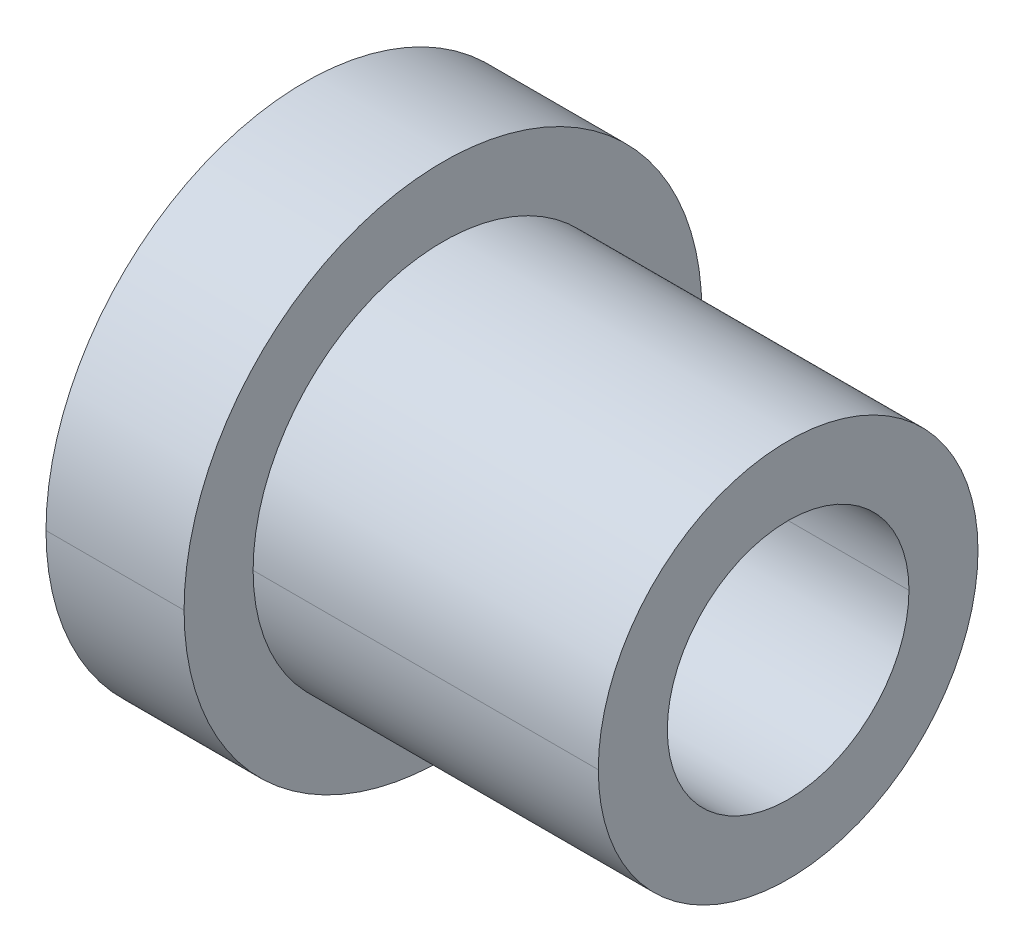
ISO-10303-21;
HEADER;
FILE_DESCRIPTION(('STEP AP214'),'2;1');
FILE_NAME('part.step','',(''),(''),'','','');
FILE_SCHEMA(('AUTOMOTIVE_DESIGN { 1 0 10303 214 1 1 1 1 }'));
ENDSEC;
DATA;
#1=APPLICATION_CONTEXT('core data for automotive mechanical design processes');
#2=APPLICATION_PROTOCOL_DEFINITION('international standard','automotive_design',2000,#1);
#3=PRODUCT_CONTEXT('',#1,'mechanical');
#4=PRODUCT('Part','Part','',(#3));
#5=PRODUCT_RELATED_PRODUCT_CATEGORY('part','',(#4));
#6=PRODUCT_DEFINITION_FORMATION('','',#4);
#7=PRODUCT_DEFINITION_CONTEXT('part definition',#1,'design');
#8=PRODUCT_DEFINITION('design','',#6,#7);
#9=PRODUCT_DEFINITION_SHAPE('','',#8);
#10=(LENGTH_UNIT() NAMED_UNIT(*) SI_UNIT(.MILLI.,.METRE.));
#11=(NAMED_UNIT(*) PLANE_ANGLE_UNIT() SI_UNIT($,.RADIAN.));
#12=(NAMED_UNIT(*) SI_UNIT($,.STERADIAN.) SOLID_ANGLE_UNIT());
#13=UNCERTAINTY_MEASURE_WITH_UNIT(LENGTH_MEASURE(1.E-05),#10,'distance_accuracy_value','');
#14=(GEOMETRIC_REPRESENTATION_CONTEXT(3) GLOBAL_UNCERTAINTY_ASSIGNED_CONTEXT((#13)) GLOBAL_UNIT_ASSIGNED_CONTEXT((#10,
#11,#12)) REPRESENTATION_CONTEXT('',''));
#15=CARTESIAN_POINT('',(0.,0.,0.));
#16=DIRECTION('',(0.,0.,1.));
#17=DIRECTION('',(1.,0.,0.));
#18=AXIS2_PLACEMENT_3D('',#15,#16,#17);
#19=CARTESIAN_POINT('',(7.,0.,0.));
#20=DIRECTION('',(-1.,0.,0.));
#21=DIRECTION('',(0.,0.,-1.));
#22=AXIS2_PLACEMENT_3D('',#19,#20,#21);
#23=CYLINDRICAL_SURFACE('',#22,1.75);
#24=DIRECTION('',(-1.,0.,0.));
#25=VECTOR('',#24,1.);
#26=CARTESIAN_POINT('',(7.,0.,-1.75));
#27=LINE('',#26,#25);
#28=CARTESIAN_POINT('',(7.,0.,-1.75));
#29=VERTEX_POINT('',#28);
#30=CARTESIAN_POINT('',(0.,0.,-1.75));
#31=VERTEX_POINT('',#30);
#32=EDGE_CURVE('E141',#29,#31,#27,.T.);
#33=ORIENTED_EDGE('',*,*,#32,.F.);
#34=CARTESIAN_POINT('',(7.,0.,0.));
#35=DIRECTION('',(-1.,0.,0.));
#36=DIRECTION('',(0.,0.,1.));
#37=AXIS2_PLACEMENT_3D('',#34,#35,#36);
#38=CIRCLE('',#37,1.75);
#39=CARTESIAN_POINT('',(7.,0.,1.75));
#40=VERTEX_POINT('',#39);
#41=EDGE_CURVE('E11',#40,#29,#38,.T.);
#42=ORIENTED_EDGE('',*,*,#41,.F.);
#43=DIRECTION('',(-1.,0.,0.));
#44=VECTOR('',#43,1.);
#45=CARTESIAN_POINT('',(7.,0.,1.75));
#46=LINE('',#45,#44);
#47=CARTESIAN_POINT('',(0.,0.,1.75));
#48=VERTEX_POINT('',#47);
#49=EDGE_CURVE('E146',#40,#48,#46,.T.);
#50=ORIENTED_EDGE('',*,*,#49,.T.);
#51=CARTESIAN_POINT('',(0.,0.,0.));
#52=DIRECTION('',(1.,0.,0.));
#53=DIRECTION('',(0.,0.,-1.));
#54=AXIS2_PLACEMENT_3D('',#51,#52,#53);
#55=CIRCLE('',#54,1.75);
#56=EDGE_CURVE('E117',#31,#48,#55,.T.);
#57=ORIENTED_EDGE('',*,*,#56,.F.);
#58=EDGE_LOOP('',(#33,#42,#50,#57));
#59=FACE_BOUND('',#58,.T.);
#60=ADVANCED_FACE('F17',(#59),#23,.F.);
#61=CARTESIAN_POINT('',(7.,0.,0.));
#62=DIRECTION('',(-1.,0.,0.));
#63=DIRECTION('',(0.,0.,-1.));
#64=AXIS2_PLACEMENT_3D('',#61,#62,#63);
#65=CYLINDRICAL_SURFACE('',#64,2.75);
#66=DIRECTION('',(-1.,0.,0.));
#67=VECTOR('',#66,1.);
#68=CARTESIAN_POINT('',(7.,0.,-2.75));
#69=LINE('',#68,#67);
#70=CARTESIAN_POINT('',(7.,0.,-2.75));
#71=VERTEX_POINT('',#70);
#72=CARTESIAN_POINT('',(2.,0.,-2.75));
#73=VERTEX_POINT('',#72);
#74=EDGE_CURVE('E90',#71,#73,#69,.T.);
#75=ORIENTED_EDGE('',*,*,#74,.T.);
#76=CARTESIAN_POINT('',(2.,0.,0.));
#77=DIRECTION('',(-1.,0.,0.));
#78=DIRECTION('',(0.,0.,1.));
#79=AXIS2_PLACEMENT_3D('',#76,#77,#78);
#80=CIRCLE('',#79,2.75);
#81=CARTESIAN_POINT('',(2.,0.,2.75));
#82=VERTEX_POINT('',#81);
#83=EDGE_CURVE('E106',#82,#73,#80,.T.);
#84=ORIENTED_EDGE('',*,*,#83,.F.);
#85=DIRECTION('',(-1.,0.,0.));
#86=VECTOR('',#85,1.);
#87=CARTESIAN_POINT('',(7.,0.,2.75));
#88=LINE('',#87,#86);
#89=CARTESIAN_POINT('',(7.,0.,2.75));
#90=VERTEX_POINT('',#89);
#91=EDGE_CURVE('E96',#90,#82,#88,.T.);
#92=ORIENTED_EDGE('',*,*,#91,.F.);
#93=CARTESIAN_POINT('',(7.,0.,0.));
#94=DIRECTION('',(1.,0.,0.));
#95=DIRECTION('',(0.,0.,-1.));
#96=AXIS2_PLACEMENT_3D('',#93,#94,#95);
#97=CIRCLE('',#96,2.75);
#98=EDGE_CURVE('E21',#71,#90,#97,.T.);
#99=ORIENTED_EDGE('',*,*,#98,.F.);
#100=EDGE_LOOP('',(#75,#84,#92,#99));
#101=FACE_BOUND('',#100,.T.);
#102=ADVANCED_FACE('F19',(#101),#65,.T.);
#103=CARTESIAN_POINT('',(7.,1.75,0.));
#104=DIRECTION('',(1.,0.,0.));
#105=DIRECTION('',(0.,1.,0.));
#106=AXIS2_PLACEMENT_3D('',#103,#104,#105);
#107=PLANE('',#106);
#108=ORIENTED_EDGE('',*,*,#41,.T.);
#109=CARTESIAN_POINT('',(7.,0.,0.));
#110=DIRECTION('',(-1.,0.,0.));
#111=DIRECTION('',(0.,0.,-1.));
#112=AXIS2_PLACEMENT_3D('',#109,#110,#111);
#113=CIRCLE('',#112,1.75);
#114=EDGE_CURVE('E145',#29,#40,#113,.T.);
#115=ORIENTED_EDGE('',*,*,#114,.T.);
#116=EDGE_LOOP('',(#108,#115));
#117=FACE_BOUND('',#116,.T.);
#118=CARTESIAN_POINT('',(7.,0.,0.));
#119=DIRECTION('',(1.,0.,0.));
#120=DIRECTION('',(0.,0.,1.));
#121=AXIS2_PLACEMENT_3D('',#118,#119,#120);
#122=CIRCLE('',#121,2.75);
#123=EDGE_CURVE('E101',#90,#71,#122,.T.);
#124=ORIENTED_EDGE('',*,*,#123,.T.);
#125=ORIENTED_EDGE('',*,*,#98,.T.);
#126=EDGE_LOOP('',(#124,#125));
#127=FACE_BOUND('',#126,.T.);
#128=ADVANCED_FACE('F173',(#117,#127),#107,.T.);
#129=CARTESIAN_POINT('',(7.,0.,0.));
#130=DIRECTION('',(-1.,0.,0.));
#131=DIRECTION('',(0.,0.,-1.));
#132=AXIS2_PLACEMENT_3D('',#129,#130,#131);
#133=CYLINDRICAL_SURFACE('',#132,2.75);
#134=ORIENTED_EDGE('',*,*,#91,.T.);
#135=CARTESIAN_POINT('',(2.,0.,0.));
#136=DIRECTION('',(-1.,0.,0.));
#137=DIRECTION('',(0.,0.,-1.));
#138=AXIS2_PLACEMENT_3D('',#135,#136,#137);
#139=CIRCLE('',#138,2.75);
#140=EDGE_CURVE('E99',#73,#82,#139,.T.);
#141=ORIENTED_EDGE('',*,*,#140,.F.);
#142=ORIENTED_EDGE('',*,*,#74,.F.);
#143=ORIENTED_EDGE('',*,*,#123,.F.);
#144=EDGE_LOOP('',(#134,#141,#142,#143));
#145=FACE_BOUND('',#144,.T.);
#146=ADVANCED_FACE('F98',(#145),#133,.T.);
#147=CARTESIAN_POINT('',(7.,0.,0.));
#148=DIRECTION('',(-1.,0.,0.));
#149=DIRECTION('',(0.,0.,-1.));
#150=AXIS2_PLACEMENT_3D('',#147,#148,#149);
#151=CYLINDRICAL_SURFACE('',#150,3.75);
#152=DIRECTION('',(-1.,0.,0.));
#153=VECTOR('',#152,1.);
#154=CARTESIAN_POINT('',(2.,0.,-3.75));
#155=LINE('',#154,#153);
#156=CARTESIAN_POINT('',(2.,0.,-3.75));
#157=VERTEX_POINT('',#156);
#158=CARTESIAN_POINT('',(0.,0.,-3.75));
#159=VERTEX_POINT('',#158);
#160=EDGE_CURVE('E79',#157,#159,#155,.T.);
#161=ORIENTED_EDGE('',*,*,#160,.T.);
#162=CARTESIAN_POINT('',(0.,0.,0.));
#163=DIRECTION('',(-1.,0.,0.));
#164=DIRECTION('',(0.,0.,1.));
#165=AXIS2_PLACEMENT_3D('',#162,#163,#164);
#166=CIRCLE('',#165,3.75);
#167=CARTESIAN_POINT('',(0.,0.,3.75));
#168=VERTEX_POINT('',#167);
#169=EDGE_CURVE('E129',#168,#159,#166,.T.);
#170=ORIENTED_EDGE('',*,*,#169,.F.);
#171=DIRECTION('',(-1.,0.,0.));
#172=VECTOR('',#171,1.);
#173=CARTESIAN_POINT('',(2.,0.,3.75));
#174=LINE('',#173,#172);
#175=CARTESIAN_POINT('',(2.,0.,3.75));
#176=VERTEX_POINT('',#175);
#177=EDGE_CURVE('E118',#176,#168,#174,.T.);
#178=ORIENTED_EDGE('',*,*,#177,.F.);
#179=CARTESIAN_POINT('',(2.,0.,0.));
#180=DIRECTION('',(1.,0.,0.));
#181=DIRECTION('',(0.,0.,-1.));
#182=AXIS2_PLACEMENT_3D('',#179,#180,#181);
#183=CIRCLE('',#182,3.75);
#184=EDGE_CURVE('E68',#157,#176,#183,.T.);
#185=ORIENTED_EDGE('',*,*,#184,.F.);
#186=EDGE_LOOP('',(#161,#170,#178,#185));
#187=FACE_BOUND('',#186,.T.);
#188=ADVANCED_FACE('F182',(#187),#151,.T.);
#189=CARTESIAN_POINT('',(2.,2.75,0.));
#190=DIRECTION('',(1.,0.,0.));
#191=DIRECTION('',(0.,1.,0.));
#192=AXIS2_PLACEMENT_3D('',#189,#190,#191);
#193=PLANE('',#192);
#194=ORIENTED_EDGE('',*,*,#83,.T.);
#195=ORIENTED_EDGE('',*,*,#140,.T.);
#196=EDGE_LOOP('',(#194,#195));
#197=FACE_BOUND('',#196,.T.);
#198=CARTESIAN_POINT('',(2.,0.,0.));
#199=DIRECTION('',(1.,0.,0.));
#200=DIRECTION('',(0.,0.,1.));
#201=AXIS2_PLACEMENT_3D('',#198,#199,#200);
#202=CIRCLE('',#201,3.75);
#203=EDGE_CURVE('E114',#176,#157,#202,.T.);
#204=ORIENTED_EDGE('',*,*,#203,.T.);
#205=ORIENTED_EDGE('',*,*,#184,.T.);
#206=EDGE_LOOP('',(#204,#205));
#207=FACE_BOUND('',#206,.T.);
#208=ADVANCED_FACE('F105',(#197,#207),#193,.T.);
#209=CARTESIAN_POINT('',(7.,0.,0.));
#210=DIRECTION('',(-1.,0.,0.));
#211=DIRECTION('',(0.,0.,-1.));
#212=AXIS2_PLACEMENT_3D('',#209,#210,#211);
#213=CYLINDRICAL_SURFACE('',#212,3.75);
#214=ORIENTED_EDGE('',*,*,#177,.T.);
#215=CARTESIAN_POINT('',(0.,0.,0.));
#216=DIRECTION('',(-1.,0.,0.));
#217=DIRECTION('',(0.,0.,-1.));
#218=AXIS2_PLACEMENT_3D('',#215,#216,#217);
#219=CIRCLE('',#218,3.75);
#220=EDGE_CURVE('E119',#159,#168,#219,.T.);
#221=ORIENTED_EDGE('',*,*,#220,.F.);
#222=ORIENTED_EDGE('',*,*,#160,.F.);
#223=ORIENTED_EDGE('',*,*,#203,.F.);
#224=EDGE_LOOP('',(#214,#221,#222,#223));
#225=FACE_BOUND('',#224,.T.);
#226=ADVANCED_FACE('F193',(#225),#213,.T.);
#227=CARTESIAN_POINT('',(0.,3.75,0.));
#228=DIRECTION('',(-1.,0.,0.));
#229=DIRECTION('',(0.,0.,1.));
#230=AXIS2_PLACEMENT_3D('',#227,#228,#229);
#231=PLANE('',#230);
#232=CARTESIAN_POINT('',(0.,0.,0.));
#233=DIRECTION('',(1.,0.,0.));
#234=DIRECTION('',(0.,0.,1.));
#235=AXIS2_PLACEMENT_3D('',#232,#233,#234);
#236=CIRCLE('',#235,1.75);
#237=EDGE_CURVE('E136',#48,#31,#236,.T.);
#238=ORIENTED_EDGE('',*,*,#237,.T.);
#239=ORIENTED_EDGE('',*,*,#56,.T.);
#240=EDGE_LOOP('',(#238,#239));
#241=FACE_BOUND('',#240,.T.);
#242=ORIENTED_EDGE('',*,*,#169,.T.);
#243=ORIENTED_EDGE('',*,*,#220,.T.);
#244=EDGE_LOOP('',(#242,#243));
#245=FACE_BOUND('',#244,.T.);
#246=ADVANCED_FACE('F196',(#241,#245),#231,.T.);
#247=CARTESIAN_POINT('',(7.,0.,0.));
#248=DIRECTION('',(-1.,0.,0.));
#249=DIRECTION('',(0.,0.,-1.));
#250=AXIS2_PLACEMENT_3D('',#247,#248,#249);
#251=CYLINDRICAL_SURFACE('',#250,1.75);
#252=ORIENTED_EDGE('',*,*,#49,.F.);
#253=ORIENTED_EDGE('',*,*,#114,.F.);
#254=ORIENTED_EDGE('',*,*,#32,.T.);
#255=ORIENTED_EDGE('',*,*,#237,.F.);
#256=EDGE_LOOP('',(#252,#253,#254,#255));
#257=FACE_BOUND('',#256,.T.);
#258=ADVANCED_FACE('F200',(#257),#251,.F.);
#259=CLOSED_SHELL('',(#60,#102,#128,#146,#188,#208,#226,#246,#258));
#260=MANIFOLD_SOLID_BREP('B1',#259);
#261=ADVANCED_BREP_SHAPE_REPRESENTATION('',(#18,#260),#14);
#262=SHAPE_DEFINITION_REPRESENTATION(#9,#261);
ENDSEC;
END-ISO-10303-21;
